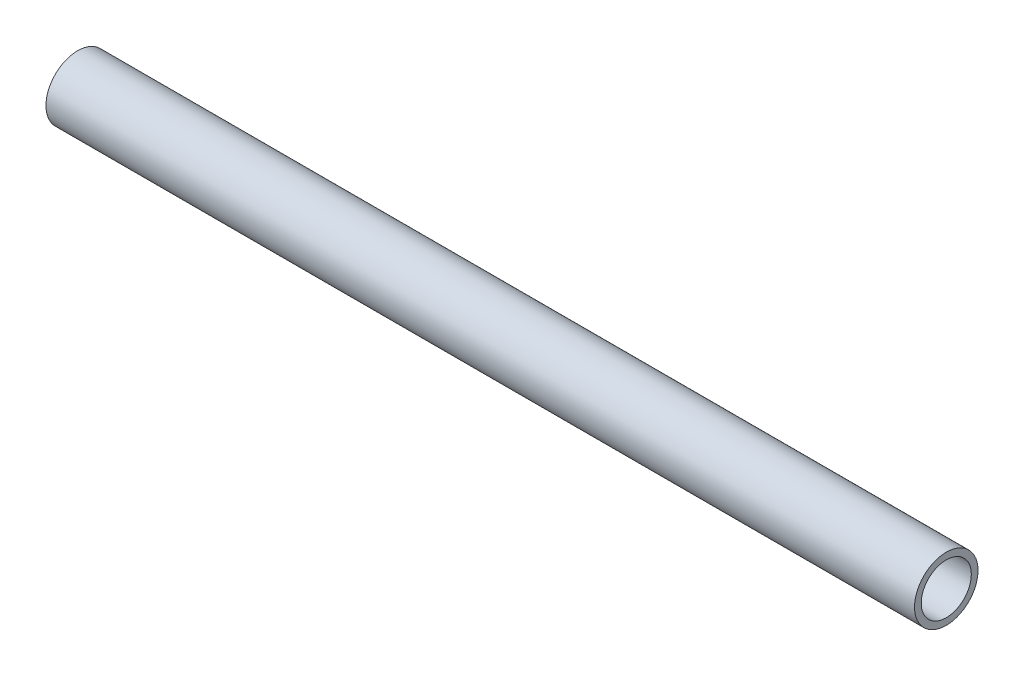
ISO-10303-21;
HEADER;
FILE_DESCRIPTION(('STEP AP214'),'2;1');
FILE_NAME('part.step','',(''),(''),'','','');
FILE_SCHEMA(('AUTOMOTIVE_DESIGN { 1 0 10303 214 1 1 1 1 }'));
ENDSEC;
DATA;
#1=APPLICATION_CONTEXT('core data for automotive mechanical design processes');
#2=APPLICATION_PROTOCOL_DEFINITION('international standard','automotive_design',2000,#1);
#3=PRODUCT_CONTEXT('',#1,'mechanical');
#4=PRODUCT('Part','Part','',(#3));
#5=PRODUCT_RELATED_PRODUCT_CATEGORY('part','',(#4));
#6=PRODUCT_DEFINITION_FORMATION('','',#4);
#7=PRODUCT_DEFINITION_CONTEXT('part definition',#1,'design');
#8=PRODUCT_DEFINITION('design','',#6,#7);
#9=PRODUCT_DEFINITION_SHAPE('','',#8);
#10=(LENGTH_UNIT() NAMED_UNIT(*) SI_UNIT(.MILLI.,.METRE.));
#11=(NAMED_UNIT(*) PLANE_ANGLE_UNIT() SI_UNIT($,.RADIAN.));
#12=(NAMED_UNIT(*) SI_UNIT($,.STERADIAN.) SOLID_ANGLE_UNIT());
#13=UNCERTAINTY_MEASURE_WITH_UNIT(LENGTH_MEASURE(1.E-05),#10,'distance_accuracy_value','');
#14=(GEOMETRIC_REPRESENTATION_CONTEXT(3) GLOBAL_UNCERTAINTY_ASSIGNED_CONTEXT((#13)) GLOBAL_UNIT_ASSIGNED_CONTEXT((#10,
#11,#12)) REPRESENTATION_CONTEXT('',''));
#15=CARTESIAN_POINT('',(0.,0.,0.));
#16=DIRECTION('',(0.,0.,1.));
#17=DIRECTION('',(1.,0.,0.));
#18=AXIS2_PLACEMENT_3D('',#15,#16,#17);
#19=CARTESIAN_POINT('',(520.,0.,0.));
#20=DIRECTION('',(1.,0.,0.));
#21=DIRECTION('',(0.,0.,-1.));
#22=AXIS2_PLACEMENT_3D('',#19,#20,#21);
#23=PLANE('',#22);
#24=CARTESIAN_POINT('',(520.,0.,0.));
#25=DIRECTION('',(1.,0.,0.));
#26=DIRECTION('',(0.,0.,-1.));
#27=AXIS2_PLACEMENT_3D('',#24,#25,#26);
#28=CIRCLE('',#27,19.);
#29=CARTESIAN_POINT('',(520.,0.,-19.));
#30=VERTEX_POINT('',#29);
#31=EDGE_CURVE('E10',#30,#30,#28,.T.);
#32=ORIENTED_EDGE('',*,*,#31,.T.);
#33=EDGE_LOOP('',(#32));
#34=FACE_BOUND('',#33,.T.);
#35=CARTESIAN_POINT('',(520.,0.,0.));
#36=DIRECTION('',(1.,0.,0.));
#37=DIRECTION('',(0.,0.,-1.));
#38=AXIS2_PLACEMENT_3D('',#35,#36,#37);
#39=CIRCLE('',#38,15.);
#40=CARTESIAN_POINT('',(520.,0.,-15.));
#41=VERTEX_POINT('',#40);
#42=EDGE_CURVE('E42',#41,#41,#39,.T.);
#43=ORIENTED_EDGE('',*,*,#42,.F.);
#44=EDGE_LOOP('',(#43));
#45=FACE_BOUND('',#44,.T.);
#46=ADVANCED_FACE('F31',(#34,#45),#23,.T.);
#47=CARTESIAN_POINT('',(0.,0.,0.));
#48=DIRECTION('',(1.,0.,0.));
#49=DIRECTION('',(0.,0.,-1.));
#50=AXIS2_PLACEMENT_3D('',#47,#48,#49);
#51=PLANE('',#50);
#52=CARTESIAN_POINT('',(0.,0.,0.));
#53=DIRECTION('',(1.,0.,0.));
#54=DIRECTION('',(0.,0.,-1.));
#55=AXIS2_PLACEMENT_3D('',#52,#53,#54);
#56=CIRCLE('',#55,19.);
#57=CARTESIAN_POINT('',(0.,0.,-19.));
#58=VERTEX_POINT('',#57);
#59=EDGE_CURVE('E35',#58,#58,#56,.T.);
#60=ORIENTED_EDGE('',*,*,#59,.F.);
#61=EDGE_LOOP('',(#60));
#62=FACE_BOUND('',#61,.T.);
#63=CARTESIAN_POINT('',(0.,0.,0.));
#64=DIRECTION('',(1.,0.,0.));
#65=DIRECTION('',(0.,0.,-1.));
#66=AXIS2_PLACEMENT_3D('',#63,#64,#65);
#67=CIRCLE('',#66,15.);
#68=CARTESIAN_POINT('',(0.,0.,-15.));
#69=VERTEX_POINT('',#68);
#70=EDGE_CURVE('E44',#69,#69,#67,.T.);
#71=ORIENTED_EDGE('',*,*,#70,.T.);
#72=EDGE_LOOP('',(#71));
#73=FACE_BOUND('',#72,.T.);
#74=ADVANCED_FACE('F54',(#62,#73),#51,.F.);
#75=CARTESIAN_POINT('',(520.,0.,0.));
#76=DIRECTION('',(-1.,0.,0.));
#77=DIRECTION('',(0.,0.,1.));
#78=AXIS2_PLACEMENT_3D('',#75,#76,#77);
#79=CYLINDRICAL_SURFACE('',#78,19.);
#80=ORIENTED_EDGE('',*,*,#31,.F.);
#81=EDGE_LOOP('',(#80));
#82=FACE_BOUND('',#81,.T.);
#83=ORIENTED_EDGE('',*,*,#59,.T.);
#84=EDGE_LOOP('',(#83));
#85=FACE_BOUND('',#84,.T.);
#86=ADVANCED_FACE('F33',(#82,#85),#79,.T.);
#87=CARTESIAN_POINT('',(520.,0.,0.));
#88=DIRECTION('',(-1.,0.,0.));
#89=DIRECTION('',(0.,0.,1.));
#90=AXIS2_PLACEMENT_3D('',#87,#88,#89);
#91=CYLINDRICAL_SURFACE('',#90,15.);
#92=ORIENTED_EDGE('',*,*,#42,.T.);
#93=EDGE_LOOP('',(#92));
#94=FACE_BOUND('',#93,.T.);
#95=ORIENTED_EDGE('',*,*,#70,.F.);
#96=EDGE_LOOP('',(#95));
#97=FACE_BOUND('',#96,.T.);
#98=ADVANCED_FACE('F50',(#94,#97),#91,.F.);
#99=CLOSED_SHELL('',(#46,#74,#86,#98));
#100=MANIFOLD_SOLID_BREP('B2',#99);
#101=ADVANCED_BREP_SHAPE_REPRESENTATION('',(#18,#100),#14);
#102=SHAPE_DEFINITION_REPRESENTATION(#9,#101);
ENDSEC;
END-ISO-10303-21;
